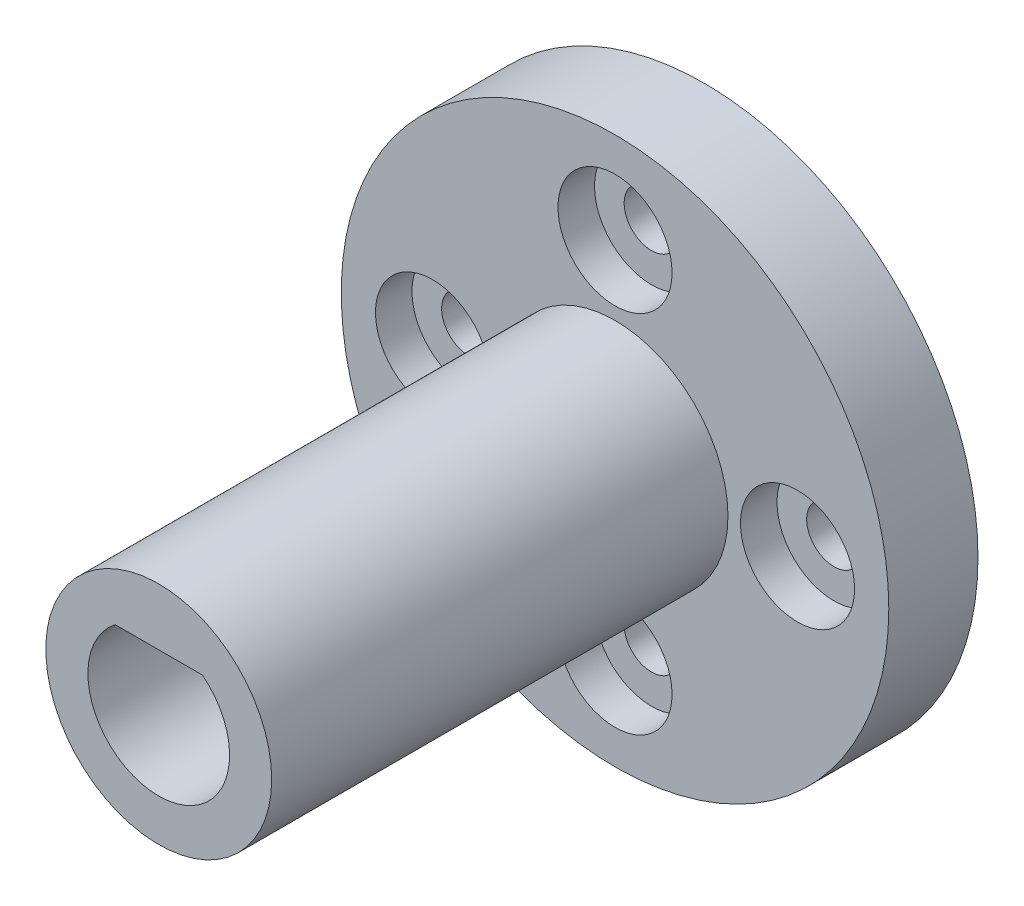
ISO-10303-21;
HEADER;
FILE_DESCRIPTION(('STEP AP214'),'2;1');
FILE_NAME('part.step','',(''),(''),'','','');
FILE_SCHEMA(('AUTOMOTIVE_DESIGN { 1 0 10303 214 1 1 1 1 }'));
ENDSEC;
DATA;
#1=APPLICATION_CONTEXT('core data for automotive mechanical design processes');
#2=APPLICATION_PROTOCOL_DEFINITION('international standard','automotive_design',2000,#1);
#3=PRODUCT_CONTEXT('',#1,'mechanical');
#4=PRODUCT('Part','Part','',(#3));
#5=PRODUCT_RELATED_PRODUCT_CATEGORY('part','',(#4));
#6=PRODUCT_DEFINITION_FORMATION('','',#4);
#7=PRODUCT_DEFINITION_CONTEXT('part definition',#1,'design');
#8=PRODUCT_DEFINITION('design','',#6,#7);
#9=PRODUCT_DEFINITION_SHAPE('','',#8);
#10=(LENGTH_UNIT() NAMED_UNIT(*) SI_UNIT(.MILLI.,.METRE.));
#11=(NAMED_UNIT(*) PLANE_ANGLE_UNIT() SI_UNIT($,.RADIAN.));
#12=(NAMED_UNIT(*) SI_UNIT($,.STERADIAN.) SOLID_ANGLE_UNIT());
#13=UNCERTAINTY_MEASURE_WITH_UNIT(LENGTH_MEASURE(1.E-05),#10,'distance_accuracy_value','');
#14=(GEOMETRIC_REPRESENTATION_CONTEXT(3) GLOBAL_UNCERTAINTY_ASSIGNED_CONTEXT((#13)) GLOBAL_UNIT_ASSIGNED_CONTEXT((#10,
#11,#12)) REPRESENTATION_CONTEXT('',''));
#15=CARTESIAN_POINT('',(0.,0.,0.));
#16=DIRECTION('',(0.,0.,1.));
#17=DIRECTION('',(1.,0.,0.));
#18=AXIS2_PLACEMENT_3D('',#15,#16,#17);
#19=CARTESIAN_POINT('',(0.,0.,3.91));
#20=DIRECTION('',(0.,0.,-1.));
#21=DIRECTION('',(-1.,0.,0.));
#22=AXIS2_PLACEMENT_3D('',#19,#20,#21);
#23=CYLINDRICAL_SURFACE('',#22,12.);
#24=CARTESIAN_POINT('',(0.,0.,3.91));
#25=DIRECTION('',(0.,0.,1.));
#26=DIRECTION('',(1.,0.,0.));
#27=AXIS2_PLACEMENT_3D('',#24,#25,#26);
#28=CIRCLE('',#27,12.);
#29=CARTESIAN_POINT('',(12.,0.,3.91));
#30=VERTEX_POINT('',#29);
#31=EDGE_CURVE('E11',#30,#30,#28,.T.);
#32=ORIENTED_EDGE('',*,*,#31,.F.);
#33=EDGE_LOOP('',(#32));
#34=FACE_BOUND('',#33,.T.);
#35=CARTESIAN_POINT('',(0.,0.,0.));
#36=DIRECTION('',(0.,0.,1.));
#37=DIRECTION('',(1.,0.,0.));
#38=AXIS2_PLACEMENT_3D('',#35,#36,#37);
#39=CIRCLE('',#38,12.);
#40=CARTESIAN_POINT('',(12.,0.,0.));
#41=VERTEX_POINT('',#40);
#42=EDGE_CURVE('E40',#41,#41,#39,.T.);
#43=ORIENTED_EDGE('',*,*,#42,.T.);
#44=EDGE_LOOP('',(#43));
#45=FACE_BOUND('',#44,.T.);
#46=ADVANCED_FACE('F37',(#34,#45),#23,.T.);
#47=CARTESIAN_POINT('',(0.,0.,3.91));
#48=DIRECTION('',(0.,0.,1.));
#49=DIRECTION('',(1.,0.,0.));
#50=AXIS2_PLACEMENT_3D('',#47,#48,#49);
#51=PLANE('',#50);
#52=CARTESIAN_POINT('',(8.,0.,3.91));
#53=DIRECTION('',(0.,0.,1.));
#54=DIRECTION('',(1.,0.,0.));
#55=AXIS2_PLACEMENT_3D('',#52,#53,#54);
#56=CIRCLE('',#55,2.5);
#57=CARTESIAN_POINT('',(10.5,0.,3.91));
#58=VERTEX_POINT('',#57);
#59=EDGE_CURVE('E307',#58,#58,#56,.T.);
#60=ORIENTED_EDGE('',*,*,#59,.F.);
#61=EDGE_LOOP('',(#60));
#62=FACE_BOUND('',#61,.T.);
#63=CARTESIAN_POINT('',(0.,-8.,3.91));
#64=DIRECTION('',(0.,0.,1.));
#65=DIRECTION('',(1.,0.,0.));
#66=AXIS2_PLACEMENT_3D('',#63,#64,#65);
#67=CIRCLE('',#66,2.5);
#68=CARTESIAN_POINT('',(2.5,-8.,3.91));
#69=VERTEX_POINT('',#68);
#70=EDGE_CURVE('E317',#69,#69,#67,.T.);
#71=ORIENTED_EDGE('',*,*,#70,.F.);
#72=EDGE_LOOP('',(#71));
#73=FACE_BOUND('',#72,.T.);
#74=CARTESIAN_POINT('',(-8.,0.,3.91));
#75=DIRECTION('',(0.,0.,1.));
#76=DIRECTION('',(1.,0.,0.));
#77=AXIS2_PLACEMENT_3D('',#74,#75,#76);
#78=CIRCLE('',#77,2.5);
#79=CARTESIAN_POINT('',(-5.50000000000001,0.,3.91));
#80=VERTEX_POINT('',#79);
#81=EDGE_CURVE('E329',#80,#80,#78,.T.);
#82=ORIENTED_EDGE('',*,*,#81,.F.);
#83=EDGE_LOOP('',(#82));
#84=FACE_BOUND('',#83,.T.);
#85=CARTESIAN_POINT('',(0.,8.,3.91));
#86=DIRECTION('',(0.,0.,1.));
#87=DIRECTION('',(1.,0.,0.));
#88=AXIS2_PLACEMENT_3D('',#85,#86,#87);
#89=CIRCLE('',#88,2.5);
#90=CARTESIAN_POINT('',(2.5,8.,3.91));
#91=VERTEX_POINT('',#90);
#92=EDGE_CURVE('E341',#91,#91,#89,.T.);
#93=ORIENTED_EDGE('',*,*,#92,.F.);
#94=EDGE_LOOP('',(#93));
#95=FACE_BOUND('',#94,.T.);
#96=CARTESIAN_POINT('',(0.,0.,3.91));
#97=DIRECTION('',(0.,0.,1.));
#98=DIRECTION('',(1.,0.,0.));
#99=AXIS2_PLACEMENT_3D('',#96,#97,#98);
#100=CIRCLE('',#99,4.95);
#101=CARTESIAN_POINT('',(4.95,0.,3.91));
#102=VERTEX_POINT('',#101);
#103=EDGE_CURVE('E77',#102,#102,#100,.T.);
#104=ORIENTED_EDGE('',*,*,#103,.F.);
#105=EDGE_LOOP('',(#104));
#106=FACE_BOUND('',#105,.T.);
#107=ORIENTED_EDGE('',*,*,#31,.T.);
#108=EDGE_LOOP('',(#107));
#109=FACE_BOUND('',#108,.T.);
#110=ADVANCED_FACE('F96',(#62,#73,#84,#95,#106,#109),#51,.T.);
#111=CARTESIAN_POINT('',(0.,0.,0.));
#112=DIRECTION('',(0.,0.,1.));
#113=DIRECTION('',(1.,0.,0.));
#114=AXIS2_PLACEMENT_3D('',#111,#112,#113);
#115=PLANE('',#114);
#116=CARTESIAN_POINT('',(8.,0.,0.));
#117=DIRECTION('',(0.,0.,1.));
#118=DIRECTION('',(1.,0.,0.));
#119=AXIS2_PLACEMENT_3D('',#116,#117,#118);
#120=CIRCLE('',#119,1.2);
#121=CARTESIAN_POINT('',(9.2,0.,0.));
#122=VERTEX_POINT('',#121);
#123=EDGE_CURVE('E314',#122,#122,#120,.T.);
#124=ORIENTED_EDGE('',*,*,#123,.T.);
#125=EDGE_LOOP('',(#124));
#126=FACE_BOUND('',#125,.T.);
#127=CARTESIAN_POINT('',(0.,-8.,0.));
#128=DIRECTION('',(0.,0.,1.));
#129=DIRECTION('',(1.,0.,0.));
#130=AXIS2_PLACEMENT_3D('',#127,#128,#129);
#131=CIRCLE('',#130,1.2);
#132=CARTESIAN_POINT('',(1.2,-8.,0.));
#133=VERTEX_POINT('',#132);
#134=EDGE_CURVE('E326',#133,#133,#131,.T.);
#135=ORIENTED_EDGE('',*,*,#134,.T.);
#136=EDGE_LOOP('',(#135));
#137=FACE_BOUND('',#136,.T.);
#138=CARTESIAN_POINT('',(-8.,0.,0.));
#139=DIRECTION('',(0.,0.,1.));
#140=DIRECTION('',(1.,0.,0.));
#141=AXIS2_PLACEMENT_3D('',#138,#139,#140);
#142=CIRCLE('',#141,1.2);
#143=CARTESIAN_POINT('',(-6.8,0.,0.));
#144=VERTEX_POINT('',#143);
#145=EDGE_CURVE('E338',#144,#144,#142,.T.);
#146=ORIENTED_EDGE('',*,*,#145,.T.);
#147=EDGE_LOOP('',(#146));
#148=FACE_BOUND('',#147,.T.);
#149=CARTESIAN_POINT('',(0.,8.,0.));
#150=DIRECTION('',(0.,0.,1.));
#151=DIRECTION('',(1.,0.,0.));
#152=AXIS2_PLACEMENT_3D('',#149,#150,#151);
#153=CIRCLE('',#152,1.2);
#154=CARTESIAN_POINT('',(1.2,8.,0.));
#155=VERTEX_POINT('',#154);
#156=EDGE_CURVE('E67',#155,#155,#153,.T.);
#157=ORIENTED_EDGE('',*,*,#156,.T.);
#158=EDGE_LOOP('',(#157));
#159=FACE_BOUND('',#158,.T.);
#160=CARTESIAN_POINT('',(0.,0.,0.));
#161=DIRECTION('',(0.,0.,-1.));
#162=DIRECTION('',(-1.,0.,0.));
#163=AXIS2_PLACEMENT_3D('',#160,#161,#162);
#164=CIRCLE('',#163,4.);
#165=CARTESIAN_POINT('',(-4.,0.,0.));
#166=VERTEX_POINT('',#165);
#167=EDGE_CURVE('E84',#166,#166,#164,.T.);
#168=ORIENTED_EDGE('',*,*,#167,.F.);
#169=EDGE_LOOP('',(#168));
#170=FACE_BOUND('',#169,.T.);
#171=ORIENTED_EDGE('',*,*,#42,.F.);
#172=EDGE_LOOP('',(#171));
#173=FACE_BOUND('',#172,.T.);
#174=ADVANCED_FACE('F93',(#126,#137,#148,#159,#170,#173),#115,.F.);
#175=CARTESIAN_POINT('',(0.,0.,1.91));
#176=DIRECTION('',(0.,0.,-1.));
#177=DIRECTION('',(-1.,0.,0.));
#178=AXIS2_PLACEMENT_3D('',#175,#176,#177);
#179=CYLINDRICAL_SURFACE('',#178,4.);
#180=CARTESIAN_POINT('',(0.,0.,1.91));
#181=DIRECTION('',(0.,0.,-1.));
#182=DIRECTION('',(-1.,0.,0.));
#183=AXIS2_PLACEMENT_3D('',#180,#181,#182);
#184=CIRCLE('',#183,4.);
#185=CARTESIAN_POINT('',(-4.,0.,1.91));
#186=VERTEX_POINT('',#185);
#187=EDGE_CURVE('E85',#186,#186,#184,.T.);
#188=CARTESIAN_POINT('',(-4.,0.,1.91));
#189=CARTESIAN_POINT('',(-4.,0.,1.89010416666667));
#190=CARTESIAN_POINT('',(-4.,0.,1.87020833333333));
#191=CARTESIAN_POINT('',(-4.,0.,1.83041666666667));
#192=CARTESIAN_POINT('',(-4.,0.,1.81052083333333));
#193=CARTESIAN_POINT('',(-4.,0.,1.77072916666667));
#194=CARTESIAN_POINT('',(-4.,0.,1.75083333333333));
#195=CARTESIAN_POINT('',(-4.,0.,1.71104166666667));
#196=CARTESIAN_POINT('',(-4.,0.,1.69114583333333));
#197=CARTESIAN_POINT('',(-4.,0.,1.65135416666667));
#198=CARTESIAN_POINT('',(-4.,0.,1.63145833333333));
#199=CARTESIAN_POINT('',(-4.,0.,1.59166666666667));
#200=CARTESIAN_POINT('',(-4.,0.,1.57177083333333));
#201=CARTESIAN_POINT('',(-4.,0.,1.53197916666667));
#202=CARTESIAN_POINT('',(-4.,0.,1.51208333333333));
#203=CARTESIAN_POINT('',(-4.,0.,1.47229166666667));
#204=CARTESIAN_POINT('',(-4.,0.,1.45239583333333));
#205=CARTESIAN_POINT('',(-4.,0.,1.41260416666667));
#206=CARTESIAN_POINT('',(-4.,0.,1.39270833333333));
#207=CARTESIAN_POINT('',(-4.,0.,1.35291666666667));
#208=CARTESIAN_POINT('',(-4.,0.,1.33302083333333));
#209=CARTESIAN_POINT('',(-4.,0.,1.29322916666667));
#210=CARTESIAN_POINT('',(-4.,0.,1.27333333333333));
#211=CARTESIAN_POINT('',(-4.,0.,1.23354166666667));
#212=CARTESIAN_POINT('',(-4.,0.,1.21364583333333));
#213=CARTESIAN_POINT('',(-4.,0.,1.17385416666667));
#214=CARTESIAN_POINT('',(-4.,0.,1.15395833333333));
#215=CARTESIAN_POINT('',(-4.,0.,1.11416666666667));
#216=CARTESIAN_POINT('',(-4.,0.,1.09427083333333));
#217=CARTESIAN_POINT('',(-4.,0.,1.05447916666667));
#218=CARTESIAN_POINT('',(-4.,0.,1.03458333333333));
#219=CARTESIAN_POINT('',(-4.,0.,0.994791666666667));
#220=CARTESIAN_POINT('',(-4.,0.,0.974895833333334));
#221=CARTESIAN_POINT('',(-4.,0.,0.935104166666667));
#222=CARTESIAN_POINT('',(-4.,0.,0.915208333333333));
#223=CARTESIAN_POINT('',(-4.,0.,0.875416666666667));
#224=CARTESIAN_POINT('',(-4.,0.,0.855520833333333));
#225=CARTESIAN_POINT('',(-4.,0.,0.815729166666667));
#226=CARTESIAN_POINT('',(-4.,0.,0.795833333333333));
#227=CARTESIAN_POINT('',(-4.,0.,0.756041666666667));
#228=CARTESIAN_POINT('',(-4.,0.,0.736145833333333));
#229=CARTESIAN_POINT('',(-4.,0.,0.696354166666667));
#230=CARTESIAN_POINT('',(-4.,0.,0.676458333333333));
#231=CARTESIAN_POINT('',(-4.,0.,0.636666666666667));
#232=CARTESIAN_POINT('',(-4.,0.,0.616770833333333));
#233=CARTESIAN_POINT('',(-4.,0.,0.576979166666667));
#234=CARTESIAN_POINT('',(-4.,0.,0.557083333333333));
#235=CARTESIAN_POINT('',(-4.,0.,0.517291666666667));
#236=CARTESIAN_POINT('',(-4.,0.,0.497395833333333));
#237=CARTESIAN_POINT('',(-4.,0.,0.457604166666667));
#238=CARTESIAN_POINT('',(-4.,0.,0.437708333333333));
#239=CARTESIAN_POINT('',(-4.,0.,0.397916666666667));
#240=CARTESIAN_POINT('',(-4.,0.,0.378020833333333));
#241=CARTESIAN_POINT('',(-4.,0.,0.338229166666667));
#242=CARTESIAN_POINT('',(-4.,0.,0.318333333333333));
#243=CARTESIAN_POINT('',(-4.,0.,0.278541666666667));
#244=CARTESIAN_POINT('',(-4.,0.,0.258645833333333));
#245=CARTESIAN_POINT('',(-4.,0.,0.218854166666667));
#246=CARTESIAN_POINT('',(-4.,0.,0.198958333333333));
#247=CARTESIAN_POINT('',(-4.,0.,0.159166666666667));
#248=CARTESIAN_POINT('',(-4.,0.,0.139270833333333));
#249=CARTESIAN_POINT('',(-4.,0.,0.0994791666666668));
#250=CARTESIAN_POINT('',(-4.,0.,0.0795833333333334));
#251=CARTESIAN_POINT('',(-4.,0.,0.0397916666666667));
#252=CARTESIAN_POINT('',(-4.,0.,0.0198958333333334));
#253=CARTESIAN_POINT('',(-4.,0.,0.));
#254=B_SPLINE_CURVE_WITH_KNOTS('',3,(#188,#189,#190,#191,#192,#193,#194,#195,#196,#197,#198,
#199,#200,#201,#202,#203,#204,#205,#206,#207,#208,#209,#210,#211,#212,#213,#214,#215,#216,#217,
#218,#219,#220,#221,#222,#223,#224,#225,#226,#227,#228,#229,#230,#231,#232,#233,#234,#235,#236,
#237,#238,#239,#240,#241,#242,#243,#244,#245,#246,#247,#248,#249,#250,#251,#252,#253),
.UNSPECIFIED.,.F.,.F.,(4,2,2,2,2,2,2,2,2,2,2,2,2,2,2,2,2,2,2,2,2,2,2,2,2,2,2,2,2,2,2,2,4),(0.,
0.0596874999999998,0.119375,0.1790625,0.23875,0.2984375,0.358125,0.4178125,0.4775,0.5371875,
0.596875,0.6565625,0.71625,0.7759375,0.835625,0.8953125,0.955,1.0146875,1.074375,1.1340625,
1.19375,1.2534375,1.313125,1.3728125,1.4325,1.4921875,1.551875,1.6115625,1.67125,1.7309375,
1.790625,1.8503125,1.91),.UNSPECIFIED.);
#255=EDGE_CURVE('BSEAM91',#186,#166,#254,.T.);
#256=ORIENTED_EDGE('',*,*,#187,.F.);
#257=ORIENTED_EDGE('',*,*,#167,.T.);
#258=ORIENTED_EDGE('',*,*,#255,.T.);
#259=ORIENTED_EDGE('',*,*,#255,.F.);
#260=EDGE_LOOP('',(#256,#258,#257,#259));
#261=FACE_BOUND('',#260,.T.);
#262=ADVANCED_FACE('F91',(#261),#179,.F.);
#263=CARTESIAN_POINT('',(0.,0.,1.91));
#264=DIRECTION('',(0.,0.,-1.));
#265=DIRECTION('',(-1.,0.,0.));
#266=AXIS2_PLACEMENT_3D('',#263,#264,#265);
#267=PLANE('',#266);
#268=ORIENTED_EDGE('',*,*,#187,.T.);
#269=EDGE_LOOP('',(#268));
#270=FACE_BOUND('',#269,.T.);
#271=ADVANCED_FACE('F140',(#270),#267,.T.);
#272=CARTESIAN_POINT('',(0.,2.445,23.91));
#273=DIRECTION('',(0.,-1.,0.));
#274=DIRECTION('',(0.,0.,-1.));
#275=AXIS2_PLACEMENT_3D('',#272,#273,#274);
#276=PLANE('',#275);
#277=DIRECTION('',(-1.,0.,0.));
#278=VECTOR('',#277,1.);
#279=CARTESIAN_POINT('',(0.,2.445,3.91));
#280=LINE('',#279,#278);
#281=CARTESIAN_POINT('',(1.91389654892839,2.445,3.91));
#282=VERTEX_POINT('',#281);
#283=CARTESIAN_POINT('',(-1.91389654892839,2.445,3.91));
#284=VERTEX_POINT('',#283);
#285=EDGE_CURVE('E64',#282,#284,#280,.T.);
#286=ORIENTED_EDGE('',*,*,#285,.F.);
#287=DIRECTION('',(0.,0.,-1.));
#288=VECTOR('',#287,1.);
#289=CARTESIAN_POINT('',(1.91389654892839,2.445,23.91));
#290=LINE('',#289,#288);
#291=CARTESIAN_POINT('',(1.91389654892839,2.445,23.91));
#292=VERTEX_POINT('',#291);
#293=EDGE_CURVE('E73',#292,#282,#290,.T.);
#294=ORIENTED_EDGE('',*,*,#293,.F.);
#295=DIRECTION('',(-1.,0.,0.));
#296=VECTOR('',#295,1.);
#297=CARTESIAN_POINT('',(0.,2.445,23.91));
#298=LINE('',#297,#296);
#299=CARTESIAN_POINT('',(-1.91389654892839,2.445,23.91));
#300=VERTEX_POINT('',#299);
#301=EDGE_CURVE('E71',#292,#300,#298,.T.);
#302=ORIENTED_EDGE('',*,*,#301,.T.);
#303=DIRECTION('',(0.,0.,-1.));
#304=VECTOR('',#303,1.);
#305=CARTESIAN_POINT('',(-1.91389654892839,2.445,23.91));
#306=LINE('',#305,#304);
#307=EDGE_CURVE('E58',#300,#284,#306,.T.);
#308=ORIENTED_EDGE('',*,*,#307,.T.);
#309=EDGE_LOOP('',(#286,#294,#302,#308));
#310=FACE_BOUND('',#309,.T.);
#311=ADVANCED_FACE('F69',(#310),#276,.T.);
#312=CARTESIAN_POINT('',(0.,0.,23.91));
#313=DIRECTION('',(0.,0.,-1.));
#314=DIRECTION('',(-1.,0.,0.));
#315=AXIS2_PLACEMENT_3D('',#312,#313,#314);
#316=CYLINDRICAL_SURFACE('',#315,3.105);
#317=CARTESIAN_POINT('',(0.,0.,3.91));
#318=DIRECTION('',(0.,0.,1.));
#319=DIRECTION('',(1.,0.,0.));
#320=AXIS2_PLACEMENT_3D('',#317,#318,#319);
#321=CIRCLE('',#320,3.105);
#322=EDGE_CURVE('E50',#284,#282,#321,.T.);
#323=ORIENTED_EDGE('',*,*,#322,.F.);
#324=ORIENTED_EDGE('',*,*,#307,.F.);
#325=CARTESIAN_POINT('',(0.,0.,23.91));
#326=DIRECTION('',(0.,0.,1.));
#327=DIRECTION('',(1.,0.,0.));
#328=AXIS2_PLACEMENT_3D('',#325,#326,#327);
#329=CIRCLE('',#328,3.105);
#330=EDGE_CURVE('E353',#300,#292,#329,.T.);
#331=ORIENTED_EDGE('',*,*,#330,.T.);
#332=ORIENTED_EDGE('',*,*,#293,.T.);
#333=EDGE_LOOP('',(#323,#324,#331,#332));
#334=FACE_BOUND('',#333,.T.);
#335=ADVANCED_FACE('F76',(#334),#316,.F.);
#336=CARTESIAN_POINT('',(0.,0.,23.91));
#337=DIRECTION('',(0.,0.,-1.));
#338=DIRECTION('',(-1.,0.,0.));
#339=AXIS2_PLACEMENT_3D('',#336,#337,#338);
#340=CYLINDRICAL_SURFACE('',#339,4.95);
#341=CARTESIAN_POINT('',(0.,0.,23.91));
#342=DIRECTION('',(0.,0.,1.));
#343=DIRECTION('',(1.,0.,0.));
#344=AXIS2_PLACEMENT_3D('',#341,#342,#343);
#345=CIRCLE('',#344,4.95);
#346=CARTESIAN_POINT('',(4.95,0.,23.91));
#347=VERTEX_POINT('',#346);
#348=EDGE_CURVE('E74',#347,#347,#345,.T.);
#349=ORIENTED_EDGE('',*,*,#348,.F.);
#350=EDGE_LOOP('',(#349));
#351=FACE_BOUND('',#350,.T.);
#352=ORIENTED_EDGE('',*,*,#103,.T.);
#353=EDGE_LOOP('',(#352));
#354=FACE_BOUND('',#353,.T.);
#355=ADVANCED_FACE('F125',(#351,#354),#340,.T.);
#356=CARTESIAN_POINT('',(0.,0.,23.91));
#357=DIRECTION('',(0.,0.,1.));
#358=DIRECTION('',(1.,0.,0.));
#359=AXIS2_PLACEMENT_3D('',#356,#357,#358);
#360=PLANE('',#359);
#361=ORIENTED_EDGE('',*,*,#301,.F.);
#362=ORIENTED_EDGE('',*,*,#330,.F.);
#363=EDGE_LOOP('',(#361,#362));
#364=FACE_BOUND('',#363,.T.);
#365=ORIENTED_EDGE('',*,*,#348,.T.);
#366=EDGE_LOOP('',(#365));
#367=FACE_BOUND('',#366,.T.);
#368=ADVANCED_FACE('F117',(#364,#367),#360,.T.);
#369=ORIENTED_EDGE('',*,*,#285,.T.);
#370=ORIENTED_EDGE('',*,*,#322,.T.);
#371=EDGE_LOOP('',(#369,#370));
#372=FACE_BOUND('',#371,.T.);
#373=ADVANCED_FACE('F65',(#372),#51,.T.);
#374=CARTESIAN_POINT('',(0.,8.,3.91));
#375=DIRECTION('',(0.,0.,1.));
#376=DIRECTION('',(1.,0.,0.));
#377=AXIS2_PLACEMENT_3D('',#374,#375,#376);
#378=CYLINDRICAL_SURFACE('',#377,1.2);
#379=ORIENTED_EDGE('',*,*,#156,.F.);
#380=EDGE_LOOP('',(#379));
#381=FACE_BOUND('',#380,.T.);
#382=CARTESIAN_POINT('',(0.,8.,2.31));
#383=DIRECTION('',(0.,0.,1.));
#384=DIRECTION('',(1.,0.,0.));
#385=AXIS2_PLACEMENT_3D('',#382,#383,#384);
#386=CIRCLE('',#385,1.2);
#387=CARTESIAN_POINT('',(1.2,8.,2.31));
#388=VERTEX_POINT('',#387);
#389=EDGE_CURVE('E347',#388,#388,#386,.T.);
#390=ORIENTED_EDGE('',*,*,#389,.T.);
#391=EDGE_LOOP('',(#390));
#392=FACE_BOUND('',#391,.T.);
#393=ADVANCED_FACE('F116',(#381,#392),#378,.F.);
#394=CARTESIAN_POINT('',(1.2,8.,2.31));
#395=DIRECTION('',(0.,0.,-1.));
#396=DIRECTION('',(-1.,0.,0.));
#397=AXIS2_PLACEMENT_3D('',#394,#395,#396);
#398=PLANE('',#397);
#399=ORIENTED_EDGE('',*,*,#389,.F.);
#400=EDGE_LOOP('',(#399));
#401=FACE_BOUND('',#400,.T.);
#402=CARTESIAN_POINT('',(0.,8.,2.31));
#403=DIRECTION('',(0.,0.,1.));
#404=DIRECTION('',(1.,0.,0.));
#405=AXIS2_PLACEMENT_3D('',#402,#403,#404);
#406=CIRCLE('',#405,2.5);
#407=CARTESIAN_POINT('',(2.5,8.,2.31));
#408=VERTEX_POINT('',#407);
#409=EDGE_CURVE('E344',#408,#408,#406,.T.);
#410=ORIENTED_EDGE('',*,*,#409,.T.);
#411=EDGE_LOOP('',(#410));
#412=FACE_BOUND('',#411,.T.);
#413=ADVANCED_FACE('F122',(#401,#412),#398,.F.);
#414=CARTESIAN_POINT('',(0.,8.,3.91));
#415=DIRECTION('',(0.,0.,1.));
#416=DIRECTION('',(1.,0.,0.));
#417=AXIS2_PLACEMENT_3D('',#414,#415,#416);
#418=CYLINDRICAL_SURFACE('',#417,2.5);
#419=ORIENTED_EDGE('',*,*,#409,.F.);
#420=EDGE_LOOP('',(#419));
#421=FACE_BOUND('',#420,.T.);
#422=ORIENTED_EDGE('',*,*,#92,.T.);
#423=EDGE_LOOP('',(#422));
#424=FACE_BOUND('',#423,.T.);
#425=ADVANCED_FACE('F190',(#421,#424),#418,.F.);
#426=CARTESIAN_POINT('',(-8.,0.,3.91));
#427=DIRECTION('',(0.,0.,1.));
#428=DIRECTION('',(1.,0.,0.));
#429=AXIS2_PLACEMENT_3D('',#426,#427,#428);
#430=CYLINDRICAL_SURFACE('',#429,1.2);
#431=ORIENTED_EDGE('',*,*,#145,.F.);
#432=EDGE_LOOP('',(#431));
#433=FACE_BOUND('',#432,.T.);
#434=CARTESIAN_POINT('',(-8.,0.,2.31));
#435=DIRECTION('',(0.,0.,1.));
#436=DIRECTION('',(1.,0.,0.));
#437=AXIS2_PLACEMENT_3D('',#434,#435,#436);
#438=CIRCLE('',#437,1.2);
#439=CARTESIAN_POINT('',(-6.8,0.,2.31));
#440=VERTEX_POINT('',#439);
#441=EDGE_CURVE('E335',#440,#440,#438,.T.);
#442=ORIENTED_EDGE('',*,*,#441,.T.);
#443=EDGE_LOOP('',(#442));
#444=FACE_BOUND('',#443,.T.);
#445=ADVANCED_FACE('F198',(#433,#444),#430,.F.);
#446=CARTESIAN_POINT('',(-6.8,0.,2.31));
#447=DIRECTION('',(0.,0.,-1.));
#448=DIRECTION('',(-1.,0.,0.));
#449=AXIS2_PLACEMENT_3D('',#446,#447,#448);
#450=PLANE('',#449);
#451=ORIENTED_EDGE('',*,*,#441,.F.);
#452=EDGE_LOOP('',(#451));
#453=FACE_BOUND('',#452,.T.);
#454=CARTESIAN_POINT('',(-8.,0.,2.31));
#455=DIRECTION('',(0.,0.,1.));
#456=DIRECTION('',(1.,0.,0.));
#457=AXIS2_PLACEMENT_3D('',#454,#455,#456);
#458=CIRCLE('',#457,2.5);
#459=CARTESIAN_POINT('',(-5.5,0.,2.31));
#460=VERTEX_POINT('',#459);
#461=EDGE_CURVE('E332',#460,#460,#458,.T.);
#462=ORIENTED_EDGE('',*,*,#461,.T.);
#463=EDGE_LOOP('',(#462));
#464=FACE_BOUND('',#463,.T.);
#465=ADVANCED_FACE('F218',(#453,#464),#450,.F.);
#466=CARTESIAN_POINT('',(-8.,0.,3.91));
#467=DIRECTION('',(0.,0.,1.));
#468=DIRECTION('',(1.,0.,0.));
#469=AXIS2_PLACEMENT_3D('',#466,#467,#468);
#470=CYLINDRICAL_SURFACE('',#469,2.5);
#471=ORIENTED_EDGE('',*,*,#461,.F.);
#472=EDGE_LOOP('',(#471));
#473=FACE_BOUND('',#472,.T.);
#474=ORIENTED_EDGE('',*,*,#81,.T.);
#475=EDGE_LOOP('',(#474));
#476=FACE_BOUND('',#475,.T.);
#477=ADVANCED_FACE('F228',(#473,#476),#470,.F.);
#478=CARTESIAN_POINT('',(0.,-8.,3.91));
#479=DIRECTION('',(0.,0.,1.));
#480=DIRECTION('',(1.,0.,0.));
#481=AXIS2_PLACEMENT_3D('',#478,#479,#480);
#482=CYLINDRICAL_SURFACE('',#481,1.2);
#483=ORIENTED_EDGE('',*,*,#134,.F.);
#484=EDGE_LOOP('',(#483));
#485=FACE_BOUND('',#484,.T.);
#486=CARTESIAN_POINT('',(0.,-8.,2.31));
#487=DIRECTION('',(0.,0.,1.));
#488=DIRECTION('',(1.,0.,0.));
#489=AXIS2_PLACEMENT_3D('',#486,#487,#488);
#490=CIRCLE('',#489,1.2);
#491=CARTESIAN_POINT('',(1.2,-8.,2.31));
#492=VERTEX_POINT('',#491);
#493=EDGE_CURVE('E323',#492,#492,#490,.T.);
#494=ORIENTED_EDGE('',*,*,#493,.T.);
#495=EDGE_LOOP('',(#494));
#496=FACE_BOUND('',#495,.T.);
#497=ADVANCED_FACE('F238',(#485,#496),#482,.F.);
#498=CARTESIAN_POINT('',(1.2,-8.,2.31));
#499=DIRECTION('',(0.,0.,-1.));
#500=DIRECTION('',(-1.,0.,0.));
#501=AXIS2_PLACEMENT_3D('',#498,#499,#500);
#502=PLANE('',#501);
#503=ORIENTED_EDGE('',*,*,#493,.F.);
#504=EDGE_LOOP('',(#503));
#505=FACE_BOUND('',#504,.T.);
#506=CARTESIAN_POINT('',(0.,-8.,2.31));
#507=DIRECTION('',(0.,0.,1.));
#508=DIRECTION('',(1.,0.,0.));
#509=AXIS2_PLACEMENT_3D('',#506,#507,#508);
#510=CIRCLE('',#509,2.5);
#511=CARTESIAN_POINT('',(2.5,-8.,2.31));
#512=VERTEX_POINT('',#511);
#513=EDGE_CURVE('E320',#512,#512,#510,.T.);
#514=ORIENTED_EDGE('',*,*,#513,.T.);
#515=EDGE_LOOP('',(#514));
#516=FACE_BOUND('',#515,.T.);
#517=ADVANCED_FACE('F248',(#505,#516),#502,.F.);
#518=CARTESIAN_POINT('',(0.,-8.,3.91));
#519=DIRECTION('',(0.,0.,1.));
#520=DIRECTION('',(1.,0.,0.));
#521=AXIS2_PLACEMENT_3D('',#518,#519,#520);
#522=CYLINDRICAL_SURFACE('',#521,2.5);
#523=ORIENTED_EDGE('',*,*,#513,.F.);
#524=EDGE_LOOP('',(#523));
#525=FACE_BOUND('',#524,.T.);
#526=ORIENTED_EDGE('',*,*,#70,.T.);
#527=EDGE_LOOP('',(#526));
#528=FACE_BOUND('',#527,.T.);
#529=ADVANCED_FACE('F258',(#525,#528),#522,.F.);
#530=CARTESIAN_POINT('',(8.,0.,3.91));
#531=DIRECTION('',(0.,0.,1.));
#532=DIRECTION('',(1.,0.,0.));
#533=AXIS2_PLACEMENT_3D('',#530,#531,#532);
#534=CYLINDRICAL_SURFACE('',#533,1.2);
#535=ORIENTED_EDGE('',*,*,#123,.F.);
#536=EDGE_LOOP('',(#535));
#537=FACE_BOUND('',#536,.T.);
#538=CARTESIAN_POINT('',(8.,0.,2.31));
#539=DIRECTION('',(0.,0.,1.));
#540=DIRECTION('',(1.,0.,0.));
#541=AXIS2_PLACEMENT_3D('',#538,#539,#540);
#542=CIRCLE('',#541,1.2);
#543=CARTESIAN_POINT('',(9.2,0.,2.31));
#544=VERTEX_POINT('',#543);
#545=EDGE_CURVE('E309',#544,#544,#542,.T.);
#546=ORIENTED_EDGE('',*,*,#545,.T.);
#547=EDGE_LOOP('',(#546));
#548=FACE_BOUND('',#547,.T.);
#549=ADVANCED_FACE('F268',(#537,#548),#534,.F.);
#550=CARTESIAN_POINT('',(9.2,0.,2.31));
#551=DIRECTION('',(0.,0.,-1.));
#552=DIRECTION('',(-1.,0.,0.));
#553=AXIS2_PLACEMENT_3D('',#550,#551,#552);
#554=PLANE('',#553);
#555=ORIENTED_EDGE('',*,*,#545,.F.);
#556=EDGE_LOOP('',(#555));
#557=FACE_BOUND('',#556,.T.);
#558=CARTESIAN_POINT('',(8.,0.,2.31));
#559=DIRECTION('',(0.,0.,1.));
#560=DIRECTION('',(1.,0.,0.));
#561=AXIS2_PLACEMENT_3D('',#558,#559,#560);
#562=CIRCLE('',#561,2.5);
#563=CARTESIAN_POINT('',(10.5,0.,2.31));
#564=VERTEX_POINT('',#563);
#565=EDGE_CURVE('E305',#564,#564,#562,.T.);
#566=ORIENTED_EDGE('',*,*,#565,.T.);
#567=EDGE_LOOP('',(#566));
#568=FACE_BOUND('',#567,.T.);
#569=ADVANCED_FACE('F278',(#557,#568),#554,.F.);
#570=CARTESIAN_POINT('',(8.,0.,3.91));
#571=DIRECTION('',(0.,0.,1.));
#572=DIRECTION('',(1.,0.,0.));
#573=AXIS2_PLACEMENT_3D('',#570,#571,#572);
#574=CYLINDRICAL_SURFACE('',#573,2.5);
#575=ORIENTED_EDGE('',*,*,#565,.F.);
#576=EDGE_LOOP('',(#575));
#577=FACE_BOUND('',#576,.T.);
#578=ORIENTED_EDGE('',*,*,#59,.T.);
#579=EDGE_LOOP('',(#578));
#580=FACE_BOUND('',#579,.T.);
#581=ADVANCED_FACE('F288',(#577,#580),#574,.F.);
#582=CLOSED_SHELL('',(#46,#110,#174,#262,#271,#311,#335,#355,#368,#373,#393,#413,#425,#445,#465,
#477,#497,#517,#529,#549,#569,#581));
#583=MANIFOLD_SOLID_BREP('B2',#582);
#584=ADVANCED_BREP_SHAPE_REPRESENTATION('',(#18,#583),#14);
#585=SHAPE_DEFINITION_REPRESENTATION(#9,#584);
ENDSEC;
END-ISO-10303-21;
